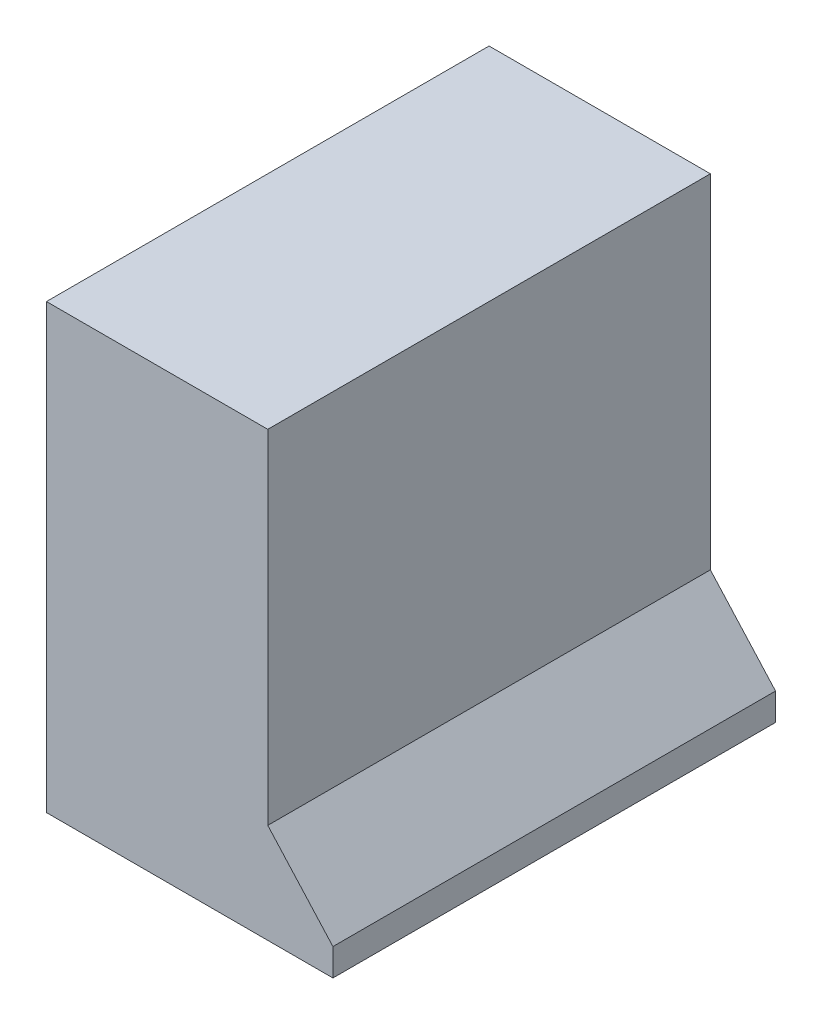
ISO-10303-21;
HEADER;
FILE_DESCRIPTION(('STEP AP214'),'2;1');
FILE_NAME('part.step','',(''),(''),'','','');
FILE_SCHEMA(('AUTOMOTIVE_DESIGN { 1 0 10303 214 1 1 1 1 }'));
ENDSEC;
DATA;
#1=APPLICATION_CONTEXT('core data for automotive mechanical design processes');
#2=APPLICATION_PROTOCOL_DEFINITION('international standard','automotive_design',2000,#1);
#3=PRODUCT_CONTEXT('',#1,'mechanical');
#4=PRODUCT('Part','Part','',(#3));
#5=PRODUCT_RELATED_PRODUCT_CATEGORY('part','',(#4));
#6=PRODUCT_DEFINITION_FORMATION('','',#4);
#7=PRODUCT_DEFINITION_CONTEXT('part definition',#1,'design');
#8=PRODUCT_DEFINITION('design','',#6,#7);
#9=PRODUCT_DEFINITION_SHAPE('','',#8);
#10=(LENGTH_UNIT() NAMED_UNIT(*) SI_UNIT(.MILLI.,.METRE.));
#11=(NAMED_UNIT(*) PLANE_ANGLE_UNIT() SI_UNIT($,.RADIAN.));
#12=(NAMED_UNIT(*) SI_UNIT($,.STERADIAN.) SOLID_ANGLE_UNIT());
#13=UNCERTAINTY_MEASURE_WITH_UNIT(LENGTH_MEASURE(1.E-05),#10,'distance_accuracy_value','');
#14=(GEOMETRIC_REPRESENTATION_CONTEXT(3) GLOBAL_UNCERTAINTY_ASSIGNED_CONTEXT((#13)) GLOBAL_UNIT_ASSIGNED_CONTEXT((#10,
#11,#12)) REPRESENTATION_CONTEXT('',''));
#15=CARTESIAN_POINT('',(0.,0.,0.));
#16=DIRECTION('',(0.,0.,1.));
#17=DIRECTION('',(1.,0.,0.));
#18=AXIS2_PLACEMENT_3D('',#15,#16,#17);
#19=CARTESIAN_POINT('',(630.340419507592,-11299.1797340283,20000.));
#20=DIRECTION('',(-1.,0.,0.));
#21=DIRECTION('',(0.,0.,1.));
#22=AXIS2_PLACEMENT_3D('',#19,#20,#21);
#23=PLANE('',#22);
#24=DIRECTION('',(0.,1.,0.));
#25=VECTOR('',#24,1.);
#26=CARTESIAN_POINT('',(630.340419507592,-11299.1797340283,0.));
#27=LINE('',#26,#25);
#28=CARTESIAN_POINT('',(630.340419507592,-11299.1797340283,0.));
#29=VERTEX_POINT('',#28);
#30=CARTESIAN_POINT('',(630.340419507592,4200.82026597172,0.));
#31=VERTEX_POINT('',#30);
#32=EDGE_CURVE('E117',#29,#31,#27,.T.);
#33=ORIENTED_EDGE('',*,*,#32,.T.);
#34=DIRECTION('',(0.,0.,-1.));
#35=VECTOR('',#34,1.);
#36=CARTESIAN_POINT('',(630.340419507592,4200.82026597172,20000.));
#37=LINE('',#36,#35);
#38=CARTESIAN_POINT('',(630.340419507592,4200.82026597172,20000.));
#39=VERTEX_POINT('',#38);
#40=EDGE_CURVE('E11',#39,#31,#37,.T.);
#41=ORIENTED_EDGE('',*,*,#40,.F.);
#42=DIRECTION('',(0.,1.,0.));
#43=VECTOR('',#42,1.);
#44=CARTESIAN_POINT('',(630.340419507592,-11299.1797340283,20000.));
#45=LINE('',#44,#43);
#46=CARTESIAN_POINT('',(630.340419507592,-11299.1797340283,20000.));
#47=VERTEX_POINT('',#46);
#48=EDGE_CURVE('E127',#47,#39,#45,.T.);
#49=ORIENTED_EDGE('',*,*,#48,.F.);
#50=DIRECTION('',(0.,0.,-1.));
#51=VECTOR('',#50,1.);
#52=CARTESIAN_POINT('',(630.340419507592,-11299.1797340283,20000.));
#53=LINE('',#52,#51);
#54=EDGE_CURVE('E113',#47,#29,#53,.T.);
#55=ORIENTED_EDGE('',*,*,#54,.T.);
#56=EDGE_LOOP('',(#33,#41,#49,#55));
#57=FACE_BOUND('',#56,.T.);
#58=ADVANCED_FACE('F33',(#57),#23,.F.);
#59=CARTESIAN_POINT('',(-9369.65958049241,4200.82026597172,20000.));
#60=DIRECTION('',(0.,-1.,0.));
#61=DIRECTION('',(1.,0.,0.));
#62=AXIS2_PLACEMENT_3D('',#59,#60,#61);
#63=PLANE('',#62);
#64=DIRECTION('',(-1.,0.,0.));
#65=VECTOR('',#64,1.);
#66=CARTESIAN_POINT('',(-9369.65958049241,4200.82026597172,0.));
#67=LINE('',#66,#65);
#68=CARTESIAN_POINT('',(-9369.65958049241,4200.82026597172,0.));
#69=VERTEX_POINT('',#68);
#70=EDGE_CURVE('E120',#31,#69,#67,.T.);
#71=ORIENTED_EDGE('',*,*,#70,.T.);
#72=DIRECTION('',(0.,0.,-1.));
#73=VECTOR('',#72,1.);
#74=CARTESIAN_POINT('',(-9369.65958049241,4200.82026597172,20000.));
#75=LINE('',#74,#73);
#76=CARTESIAN_POINT('',(-9369.65958049241,4200.82026597172,20000.));
#77=VERTEX_POINT('',#76);
#78=EDGE_CURVE('E41',#77,#69,#75,.T.);
#79=ORIENTED_EDGE('',*,*,#78,.F.);
#80=DIRECTION('',(-1.,0.,0.));
#81=VECTOR('',#80,1.);
#82=CARTESIAN_POINT('',(-9369.65958049241,4200.82026597172,20000.));
#83=LINE('',#82,#81);
#84=EDGE_CURVE('E86',#39,#77,#83,.T.);
#85=ORIENTED_EDGE('',*,*,#84,.F.);
#86=ORIENTED_EDGE('',*,*,#40,.T.);
#87=EDGE_LOOP('',(#71,#79,#85,#86));
#88=FACE_BOUND('',#87,.T.);
#89=ADVANCED_FACE('F151',(#88),#63,.F.);
#90=CARTESIAN_POINT('',(-9369.65958049241,4200.82026597172,20000.));
#91=DIRECTION('',(1.,0.,0.));
#92=DIRECTION('',(0.,1.,0.));
#93=AXIS2_PLACEMENT_3D('',#90,#91,#92);
#94=PLANE('',#93);
#95=DIRECTION('',(0.,-1.,0.));
#96=VECTOR('',#95,1.);
#97=CARTESIAN_POINT('',(-9369.65958049241,4200.82026597172,0.));
#98=LINE('',#97,#96);
#99=CARTESIAN_POINT('',(-9369.65958049241,-15799.1797340283,0.));
#100=VERTEX_POINT('',#99);
#101=EDGE_CURVE('E122',#69,#100,#98,.T.);
#102=ORIENTED_EDGE('',*,*,#101,.T.);
#103=DIRECTION('',(0.,0.,-1.));
#104=VECTOR('',#103,1.);
#105=CARTESIAN_POINT('',(-9369.65958049241,-15799.1797340283,20000.));
#106=LINE('',#105,#104);
#107=CARTESIAN_POINT('',(-9369.65958049241,-15799.1797340283,20000.));
#108=VERTEX_POINT('',#107);
#109=EDGE_CURVE('E108',#108,#100,#106,.T.);
#110=ORIENTED_EDGE('',*,*,#109,.F.);
#111=DIRECTION('',(0.,-1.,0.));
#112=VECTOR('',#111,1.);
#113=CARTESIAN_POINT('',(-9369.65958049241,4200.82026597172,20000.));
#114=LINE('',#113,#112);
#115=EDGE_CURVE('E99',#77,#108,#114,.T.);
#116=ORIENTED_EDGE('',*,*,#115,.F.);
#117=ORIENTED_EDGE('',*,*,#78,.T.);
#118=EDGE_LOOP('',(#102,#110,#116,#117));
#119=FACE_BOUND('',#118,.T.);
#120=ADVANCED_FACE('F133',(#119),#94,.F.);
#121=CARTESIAN_POINT('',(-9369.65958049241,-15799.1797340283,20000.));
#122=DIRECTION('',(0.,1.,0.));
#123=DIRECTION('',(0.,0.,1.));
#124=AXIS2_PLACEMENT_3D('',#121,#122,#123);
#125=PLANE('',#124);
#126=DIRECTION('',(1.,0.,0.));
#127=VECTOR('',#126,1.);
#128=CARTESIAN_POINT('',(-9369.65958049241,-15799.1797340283,0.));
#129=LINE('',#128,#127);
#130=CARTESIAN_POINT('',(3574.51508748655,-15799.1797340283,0.));
#131=VERTEX_POINT('',#130);
#132=EDGE_CURVE('E107',#100,#131,#129,.T.);
#133=ORIENTED_EDGE('',*,*,#132,.T.);
#134=DIRECTION('',(0.,0.,-1.));
#135=VECTOR('',#134,1.);
#136=CARTESIAN_POINT('',(3574.51508748655,-15799.1797340283,20000.));
#137=LINE('',#136,#135);
#138=CARTESIAN_POINT('',(3574.51508748655,-15799.1797340283,20000.));
#139=VERTEX_POINT('',#138);
#140=EDGE_CURVE('E104',#139,#131,#137,.T.);
#141=ORIENTED_EDGE('',*,*,#140,.F.);
#142=DIRECTION('',(1.,0.,0.));
#143=VECTOR('',#142,1.);
#144=CARTESIAN_POINT('',(-9369.65958049241,-15799.1797340283,20000.));
#145=LINE('',#144,#143);
#146=EDGE_CURVE('E93',#108,#139,#145,.T.);
#147=ORIENTED_EDGE('',*,*,#146,.F.);
#148=ORIENTED_EDGE('',*,*,#109,.T.);
#149=EDGE_LOOP('',(#133,#141,#147,#148));
#150=FACE_BOUND('',#149,.T.);
#151=ADVANCED_FACE('F105',(#150),#125,.F.);
#152=CARTESIAN_POINT('',(3574.51508748655,-15799.1797340283,20000.));
#153=DIRECTION('',(-1.,0.,0.));
#154=DIRECTION('',(0.,-1.,0.));
#155=AXIS2_PLACEMENT_3D('',#152,#153,#154);
#156=PLANE('',#155);
#157=DIRECTION('',(0.,1.,0.));
#158=VECTOR('',#157,1.);
#159=CARTESIAN_POINT('',(3574.51508748655,-15799.1797340283,0.));
#160=LINE('',#159,#158);
#161=CARTESIAN_POINT('',(3574.51508748655,-14569.0169661288,0.));
#162=VERTEX_POINT('',#161);
#163=EDGE_CURVE('E72',#131,#162,#160,.T.);
#164=ORIENTED_EDGE('',*,*,#163,.T.);
#165=DIRECTION('',(0.,0.,-1.));
#166=VECTOR('',#165,1.);
#167=CARTESIAN_POINT('',(3574.51508748655,-14569.0169661288,20000.));
#168=LINE('',#167,#166);
#169=CARTESIAN_POINT('',(3574.51508748655,-14569.0169661288,20000.));
#170=VERTEX_POINT('',#169);
#171=EDGE_CURVE('E109',#170,#162,#168,.T.);
#172=ORIENTED_EDGE('',*,*,#171,.F.);
#173=DIRECTION('',(0.,1.,0.));
#174=VECTOR('',#173,1.);
#175=CARTESIAN_POINT('',(3574.51508748655,-15799.1797340283,20000.));
#176=LINE('',#175,#174);
#177=EDGE_CURVE('E97',#139,#170,#176,.T.);
#178=ORIENTED_EDGE('',*,*,#177,.F.);
#179=ORIENTED_EDGE('',*,*,#140,.T.);
#180=EDGE_LOOP('',(#164,#172,#178,#179));
#181=FACE_BOUND('',#180,.T.);
#182=ADVANCED_FACE('F111',(#181),#156,.F.);
#183=CARTESIAN_POINT('',(3574.51508748655,-14569.0169661288,20000.));
#184=DIRECTION('',(-0.743144825477398,-0.669130606358854,0.));
#185=DIRECTION('',(0.669130606358854,-0.743144825477398,0.));
#186=AXIS2_PLACEMENT_3D('',#183,#184,#185);
#187=PLANE('',#186);
#188=DIRECTION('',(-0.669130606358854,0.743144825477398,0.));
#189=VECTOR('',#188,1.);
#190=CARTESIAN_POINT('',(3574.51508748655,-14569.0169661288,0.));
#191=LINE('',#190,#189);
#192=EDGE_CURVE('E78',#162,#29,#191,.T.);
#193=ORIENTED_EDGE('',*,*,#192,.T.);
#194=ORIENTED_EDGE('',*,*,#54,.F.);
#195=DIRECTION('',(-0.669130606358854,0.743144825477398,0.));
#196=VECTOR('',#195,1.);
#197=CARTESIAN_POINT('',(3574.51508748655,-14569.0169661288,20000.));
#198=LINE('',#197,#196);
#199=EDGE_CURVE('E49',#170,#47,#198,.T.);
#200=ORIENTED_EDGE('',*,*,#199,.F.);
#201=ORIENTED_EDGE('',*,*,#171,.T.);
#202=EDGE_LOOP('',(#193,#194,#200,#201));
#203=FACE_BOUND('',#202,.T.);
#204=ADVANCED_FACE('F140',(#203),#187,.F.);
#205=CARTESIAN_POINT('',(0.,0.,20000.));
#206=DIRECTION('',(0.,0.,-1.));
#207=DIRECTION('',(-1.,0.,0.));
#208=AXIS2_PLACEMENT_3D('',#205,#206,#207);
#209=PLANE('',#208);
#210=ORIENTED_EDGE('',*,*,#48,.T.);
#211=ORIENTED_EDGE('',*,*,#84,.T.);
#212=ORIENTED_EDGE('',*,*,#115,.T.);
#213=ORIENTED_EDGE('',*,*,#146,.T.);
#214=ORIENTED_EDGE('',*,*,#177,.T.);
#215=ORIENTED_EDGE('',*,*,#199,.T.);
#216=EDGE_LOOP('',(#210,#211,#212,#213,#214,#215));
#217=FACE_BOUND('',#216,.T.);
#218=ADVANCED_FACE('F95',(#217),#209,.F.);
#219=CARTESIAN_POINT('',(0.,0.,0.));
#220=DIRECTION('',(0.,0.,-1.));
#221=DIRECTION('',(-1.,0.,0.));
#222=AXIS2_PLACEMENT_3D('',#219,#220,#221);
#223=PLANE('',#222);
#224=ORIENTED_EDGE('',*,*,#32,.F.);
#225=ORIENTED_EDGE('',*,*,#192,.F.);
#226=ORIENTED_EDGE('',*,*,#163,.F.);
#227=ORIENTED_EDGE('',*,*,#132,.F.);
#228=ORIENTED_EDGE('',*,*,#101,.F.);
#229=ORIENTED_EDGE('',*,*,#70,.F.);
#230=EDGE_LOOP('',(#224,#225,#226,#227,#228,#229));
#231=FACE_BOUND('',#230,.T.);
#232=ADVANCED_FACE('F136',(#231),#223,.T.);
#233=CLOSED_SHELL('',(#58,#89,#120,#151,#182,#204,#218,#232));
#234=MANIFOLD_SOLID_BREP('B2',#233);
#235=ADVANCED_BREP_SHAPE_REPRESENTATION('',(#18,#234),#14);
#236=SHAPE_DEFINITION_REPRESENTATION(#9,#235);
ENDSEC;
END-ISO-10303-21;
